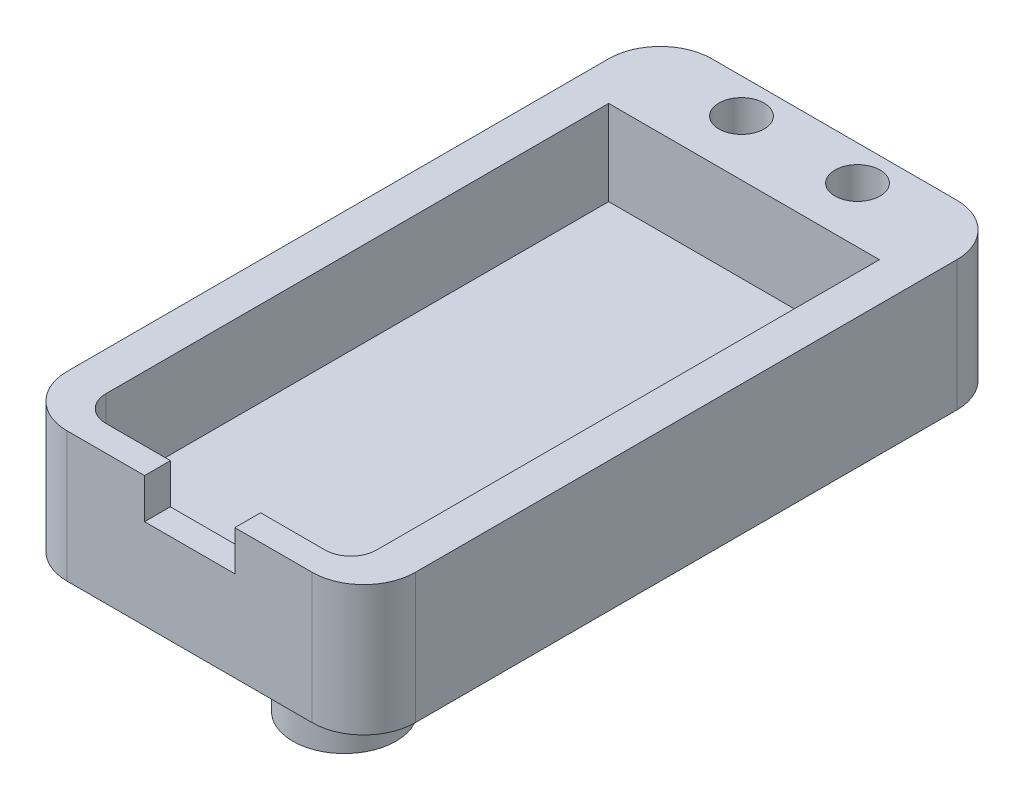
ISO-10303-21;
HEADER;
FILE_DESCRIPTION(('STEP AP214'),'2;1');
FILE_NAME('part.step','',(''),(''),'','','');
FILE_SCHEMA(('AUTOMOTIVE_DESIGN { 1 0 10303 214 1 1 1 1 }'));
ENDSEC;
DATA;
#1=APPLICATION_CONTEXT('core data for automotive mechanical design processes');
#2=APPLICATION_PROTOCOL_DEFINITION('international standard','automotive_design',2000,#1);
#3=PRODUCT_CONTEXT('',#1,'mechanical');
#4=PRODUCT('Part','Part','',(#3));
#5=PRODUCT_RELATED_PRODUCT_CATEGORY('part','',(#4));
#6=PRODUCT_DEFINITION_FORMATION('','',#4);
#7=PRODUCT_DEFINITION_CONTEXT('part definition',#1,'design');
#8=PRODUCT_DEFINITION('design','',#6,#7);
#9=PRODUCT_DEFINITION_SHAPE('','',#8);
#10=(LENGTH_UNIT() NAMED_UNIT(*) SI_UNIT(.MILLI.,.METRE.));
#11=(NAMED_UNIT(*) PLANE_ANGLE_UNIT() SI_UNIT($,.RADIAN.));
#12=(NAMED_UNIT(*) SI_UNIT($,.STERADIAN.) SOLID_ANGLE_UNIT());
#13=UNCERTAINTY_MEASURE_WITH_UNIT(LENGTH_MEASURE(1.E-05),#10,'distance_accuracy_value','');
#14=(GEOMETRIC_REPRESENTATION_CONTEXT(3) GLOBAL_UNCERTAINTY_ASSIGNED_CONTEXT((#13)) GLOBAL_UNIT_ASSIGNED_CONTEXT((#10,
#11,#12)) REPRESENTATION_CONTEXT('',''));
#15=CARTESIAN_POINT('',(0.,0.,0.));
#16=DIRECTION('',(0.,0.,1.));
#17=DIRECTION('',(1.,0.,0.));
#18=AXIS2_PLACEMENT_3D('',#15,#16,#17);
#19=CARTESIAN_POINT('',(0.,3.5,-41.));
#20=DIRECTION('',(1.,0.,0.));
#21=DIRECTION('',(0.,0.,-1.));
#22=AXIS2_PLACEMENT_3D('',#19,#20,#21);
#23=PLANE('',#22);
#24=DIRECTION('',(0.,0.,1.));
#25=VECTOR('',#24,1.);
#26=CARTESIAN_POINT('',(0.,10.1,-48.));
#27=LINE('',#26,#25);
#28=CARTESIAN_POINT('',(0.,10.1,-44.));
#29=VERTEX_POINT('',#28);
#30=CARTESIAN_POINT('',(0.,10.1,-2.00000000000002));
#31=VERTEX_POINT('',#30);
#32=EDGE_CURVE('E339',#29,#31,#27,.T.);
#33=ORIENTED_EDGE('',*,*,#32,.F.);
#34=DIRECTION('',(0.,1.,0.));
#35=VECTOR('',#34,1.);
#36=CARTESIAN_POINT('',(0.,0.,-44.));
#37=LINE('',#36,#35);
#38=CARTESIAN_POINT('',(0.,0.,-44.));
#39=VERTEX_POINT('',#38);
#40=EDGE_CURVE('E253',#29,#39,#37,.F.);
#41=ORIENTED_EDGE('',*,*,#40,.T.);
#42=DIRECTION('',(0.,0.,1.));
#43=VECTOR('',#42,1.);
#44=CARTESIAN_POINT('',(0.,0.,-41.));
#45=LINE('',#44,#43);
#46=CARTESIAN_POINT('',(0.,0.,-2.));
#47=VERTEX_POINT('',#46);
#48=EDGE_CURVE('E219',#39,#47,#45,.T.);
#49=ORIENTED_EDGE('',*,*,#48,.T.);
#50=DIRECTION('',(0.,-1.,0.));
#51=VECTOR('',#50,1.);
#52=CARTESIAN_POINT('',(0.,10.1,-2.));
#53=LINE('',#52,#51);
#54=EDGE_CURVE('E251',#47,#31,#53,.F.);
#55=ORIENTED_EDGE('',*,*,#54,.T.);
#56=EDGE_LOOP('',(#33,#41,#49,#55));
#57=FACE_BOUND('',#56,.T.);
#58=ADVANCED_FACE('F33',(#57),#23,.F.);
#59=CARTESIAN_POINT('',(27.,3.5,-41.));
#60=DIRECTION('',(-1.,0.,0.));
#61=DIRECTION('',(0.,0.,1.));
#62=AXIS2_PLACEMENT_3D('',#59,#60,#61);
#63=PLANE('',#62);
#64=DIRECTION('',(0.,0.,-1.));
#65=VECTOR('',#64,1.);
#66=CARTESIAN_POINT('',(27.,0.,-41.));
#67=LINE('',#66,#65);
#68=CARTESIAN_POINT('',(27.,0.,-2.));
#69=VERTEX_POINT('',#68);
#70=CARTESIAN_POINT('',(27.,0.,-44.));
#71=VERTEX_POINT('',#70);
#72=EDGE_CURVE('E224',#69,#71,#67,.T.);
#73=ORIENTED_EDGE('',*,*,#72,.T.);
#74=DIRECTION('',(0.,-1.,0.));
#75=VECTOR('',#74,1.);
#76=CARTESIAN_POINT('',(27.,10.1,-44.));
#77=LINE('',#76,#75);
#78=CARTESIAN_POINT('',(27.,10.1,-44.));
#79=VERTEX_POINT('',#78);
#80=EDGE_CURVE('E265',#71,#79,#77,.F.);
#81=ORIENTED_EDGE('',*,*,#80,.T.);
#82=DIRECTION('',(0.,0.,-1.));
#83=VECTOR('',#82,1.);
#84=CARTESIAN_POINT('',(27.,10.1,-48.));
#85=LINE('',#84,#83);
#86=CARTESIAN_POINT('',(27.,10.1,-2.00000000000002));
#87=VERTEX_POINT('',#86);
#88=EDGE_CURVE('E170',#87,#79,#85,.T.);
#89=ORIENTED_EDGE('',*,*,#88,.F.);
#90=DIRECTION('',(0.,1.,0.));
#91=VECTOR('',#90,1.);
#92=CARTESIAN_POINT('',(27.,0.,-2.));
#93=LINE('',#92,#91);
#94=EDGE_CURVE('E263',#87,#69,#93,.F.);
#95=ORIENTED_EDGE('',*,*,#94,.T.);
#96=EDGE_LOOP('',(#73,#81,#89,#95));
#97=FACE_BOUND('',#96,.T.);
#98=ADVANCED_FACE('F365',(#97),#63,.F.);
#99=CARTESIAN_POINT('',(3.,11.,0.));
#100=DIRECTION('',(-1.,0.,0.));
#101=DIRECTION('',(0.,0.,1.));
#102=AXIS2_PLACEMENT_3D('',#99,#100,#101);
#103=PLANE('',#102);
#104=DIRECTION('',(0.,0.,-1.));
#105=VECTOR('',#104,1.);
#106=CARTESIAN_POINT('',(3.,10.1,0.));
#107=LINE('',#106,#105);
#108=CARTESIAN_POINT('',(3.,10.1,-2.));
#109=VERTEX_POINT('',#108);
#110=CARTESIAN_POINT('',(3.,10.1,-41.));
#111=VERTEX_POINT('',#110);
#112=EDGE_CURVE('E313',#109,#111,#107,.T.);
#113=ORIENTED_EDGE('',*,*,#112,.F.);
#114=DIRECTION('',(0.,-1.,0.));
#115=VECTOR('',#114,1.);
#116=CARTESIAN_POINT('',(3.,3.5,-2.));
#117=LINE('',#116,#115);
#118=CARTESIAN_POINT('',(3.,3.5,-2.));
#119=VERTEX_POINT('',#118);
#120=EDGE_CURVE('E282',#109,#119,#117,.T.);
#121=ORIENTED_EDGE('',*,*,#120,.T.);
#122=DIRECTION('',(0.,0.,-1.));
#123=VECTOR('',#122,1.);
#124=CARTESIAN_POINT('',(3.,3.5,0.));
#125=LINE('',#124,#123);
#126=CARTESIAN_POINT('',(3.,3.5,-41.));
#127=VERTEX_POINT('',#126);
#128=EDGE_CURVE('E214',#119,#127,#125,.T.);
#129=ORIENTED_EDGE('',*,*,#128,.T.);
#130=DIRECTION('',(0.,-1.,0.));
#131=VECTOR('',#130,1.);
#132=CARTESIAN_POINT('',(3.,11.,-41.));
#133=LINE('',#132,#131);
#134=EDGE_CURVE('E216',#111,#127,#133,.T.);
#135=ORIENTED_EDGE('',*,*,#134,.F.);
#136=EDGE_LOOP('',(#113,#121,#129,#135));
#137=FACE_BOUND('',#136,.T.);
#138=ADVANCED_FACE('F311',(#137),#103,.F.);
#139=CARTESIAN_POINT('',(24.,11.,-41.));
#140=DIRECTION('',(1.,0.,0.));
#141=DIRECTION('',(0.,0.,-1.));
#142=AXIS2_PLACEMENT_3D('',#139,#140,#141);
#143=PLANE('',#142);
#144=DIRECTION('',(0.,0.,1.));
#145=VECTOR('',#144,1.);
#146=CARTESIAN_POINT('',(24.,3.5,-41.));
#147=LINE('',#146,#145);
#148=CARTESIAN_POINT('',(24.,3.5,-41.));
#149=VERTEX_POINT('',#148);
#150=CARTESIAN_POINT('',(24.,3.5,-2.));
#151=VERTEX_POINT('',#150);
#152=EDGE_CURVE('E210',#149,#151,#147,.T.);
#153=ORIENTED_EDGE('',*,*,#152,.T.);
#154=DIRECTION('',(0.,-1.,0.));
#155=VECTOR('',#154,1.);
#156=CARTESIAN_POINT('',(24.,10.1,-2.));
#157=LINE('',#156,#155);
#158=CARTESIAN_POINT('',(24.,10.1,-2.));
#159=VERTEX_POINT('',#158);
#160=EDGE_CURVE('E54',#151,#159,#157,.F.);
#161=ORIENTED_EDGE('',*,*,#160,.T.);
#162=DIRECTION('',(0.,0.,1.));
#163=VECTOR('',#162,1.);
#164=CARTESIAN_POINT('',(24.,10.1,-41.));
#165=LINE('',#164,#163);
#166=CARTESIAN_POINT('',(24.,10.1,-41.));
#167=VERTEX_POINT('',#166);
#168=EDGE_CURVE('E288',#167,#159,#165,.T.);
#169=ORIENTED_EDGE('',*,*,#168,.F.);
#170=DIRECTION('',(0.,-1.,0.));
#171=VECTOR('',#170,1.);
#172=CARTESIAN_POINT('',(24.,11.,-41.));
#173=LINE('',#172,#171);
#174=EDGE_CURVE('E212',#167,#149,#173,.T.);
#175=ORIENTED_EDGE('',*,*,#174,.T.);
#176=EDGE_LOOP('',(#153,#161,#169,#175));
#177=FACE_BOUND('',#176,.T.);
#178=ADVANCED_FACE('F302',(#177),#143,.F.);
#179=CARTESIAN_POINT('',(0.,0.,-41.));
#180=DIRECTION('',(0.,0.,-1.));
#181=DIRECTION('',(-1.,0.,0.));
#182=AXIS2_PLACEMENT_3D('',#179,#180,#181);
#183=PLANE('',#182);
#184=DIRECTION('',(1.,0.,0.));
#185=VECTOR('',#184,1.);
#186=CARTESIAN_POINT('',(0.,10.1,-41.));
#187=LINE('',#186,#185);
#188=EDGE_CURVE('E316',#111,#167,#187,.T.);
#189=ORIENTED_EDGE('',*,*,#188,.F.);
#190=ORIENTED_EDGE('',*,*,#134,.T.);
#191=DIRECTION('',(-1.,0.,0.));
#192=VECTOR('',#191,1.);
#193=CARTESIAN_POINT('',(0.,3.5,-41.));
#194=LINE('',#193,#192);
#195=EDGE_CURVE('E223',#149,#127,#194,.T.);
#196=ORIENTED_EDGE('',*,*,#195,.F.);
#197=ORIENTED_EDGE('',*,*,#174,.F.);
#198=EDGE_LOOP('',(#189,#190,#196,#197));
#199=FACE_BOUND('',#198,.T.);
#200=ADVANCED_FACE('F307',(#199),#183,.F.);
#201=CARTESIAN_POINT('',(0.,0.,0.));
#202=DIRECTION('',(0.,0.,1.));
#203=DIRECTION('',(1.,0.,0.));
#204=AXIS2_PLACEMENT_3D('',#201,#202,#203);
#205=PLANE('',#204);
#206=DIRECTION('',(-1.,0.,0.));
#207=VECTOR('',#206,1.);
#208=CARTESIAN_POINT('',(0.,10.1,0.));
#209=LINE('',#208,#207);
#210=CARTESIAN_POINT('',(22.,10.1,0.));
#211=VERTEX_POINT('',#210);
#212=CARTESIAN_POINT('',(17.,10.1,0.));
#213=VERTEX_POINT('',#212);
#214=EDGE_CURVE('E286',#211,#213,#209,.T.);
#215=ORIENTED_EDGE('',*,*,#214,.F.);
#216=DIRECTION('',(0.,-1.,0.));
#217=VECTOR('',#216,1.);
#218=CARTESIAN_POINT('',(22.,3.5,0.));
#219=LINE('',#218,#217);
#220=CARTESIAN_POINT('',(22.,3.5,0.));
#221=VERTEX_POINT('',#220);
#222=EDGE_CURVE('E274',#211,#221,#219,.T.);
#223=ORIENTED_EDGE('',*,*,#222,.T.);
#224=DIRECTION('',(1.,0.,0.));
#225=VECTOR('',#224,1.);
#226=CARTESIAN_POINT('',(0.,3.5,0.));
#227=LINE('',#226,#225);
#228=CARTESIAN_POINT('',(5.,3.5,0.));
#229=VERTEX_POINT('',#228);
#230=EDGE_CURVE('E220',#229,#221,#227,.T.);
#231=ORIENTED_EDGE('',*,*,#230,.F.);
#232=DIRECTION('',(0.,-1.,0.));
#233=VECTOR('',#232,1.);
#234=CARTESIAN_POINT('',(5.,10.1,0.));
#235=LINE('',#234,#233);
#236=CARTESIAN_POINT('',(5.,10.1,0.));
#237=VERTEX_POINT('',#236);
#238=EDGE_CURVE('E272',#229,#237,#235,.F.);
#239=ORIENTED_EDGE('',*,*,#238,.T.);
#240=CARTESIAN_POINT('',(10.,10.1,0.));
#241=VERTEX_POINT('',#240);
#242=EDGE_CURVE('E180',#241,#237,#209,.T.);
#243=ORIENTED_EDGE('',*,*,#242,.F.);
#244=DIRECTION('',(0.,1.,0.));
#245=VECTOR('',#244,1.);
#246=CARTESIAN_POINT('',(10.,11.,0.));
#247=LINE('',#246,#245);
#248=CARTESIAN_POINT('',(10.,7.,0.));
#249=VERTEX_POINT('',#248);
#250=EDGE_CURVE('E179',#249,#241,#247,.T.);
#251=ORIENTED_EDGE('',*,*,#250,.F.);
#252=DIRECTION('',(-1.,0.,0.));
#253=VECTOR('',#252,1.);
#254=CARTESIAN_POINT('',(10.,7.,0.));
#255=LINE('',#254,#253);
#256=CARTESIAN_POINT('',(17.,7.,0.));
#257=VERTEX_POINT('',#256);
#258=EDGE_CURVE('E201',#257,#249,#255,.T.);
#259=ORIENTED_EDGE('',*,*,#258,.F.);
#260=DIRECTION('',(0.,-1.,0.));
#261=VECTOR('',#260,1.);
#262=CARTESIAN_POINT('',(17.,11.,0.));
#263=LINE('',#262,#261);
#264=EDGE_CURVE('E192',#213,#257,#263,.T.);
#265=ORIENTED_EDGE('',*,*,#264,.F.);
#266=EDGE_LOOP('',(#215,#223,#231,#239,#243,#251,#259,#265));
#267=FACE_BOUND('',#266,.T.);
#268=ADVANCED_FACE('F293',(#267),#205,.F.);
#269=CARTESIAN_POINT('',(0.,0.,2.));
#270=DIRECTION('',(0.,0.,1.));
#271=DIRECTION('',(1.,0.,0.));
#272=AXIS2_PLACEMENT_3D('',#269,#270,#271);
#273=PLANE('',#272);
#274=DIRECTION('',(1.,0.,0.));
#275=VECTOR('',#274,1.);
#276=CARTESIAN_POINT('',(0.,0.,2.));
#277=LINE('',#276,#275);
#278=CARTESIAN_POINT('',(4.,0.,2.));
#279=VERTEX_POINT('',#278);
#280=CARTESIAN_POINT('',(23.,0.,2.));
#281=VERTEX_POINT('',#280);
#282=EDGE_CURVE('E205',#279,#281,#277,.T.);
#283=ORIENTED_EDGE('',*,*,#282,.T.);
#284=DIRECTION('',(0.,1.,0.));
#285=VECTOR('',#284,1.);
#286=CARTESIAN_POINT('',(23.,10.1,2.));
#287=LINE('',#286,#285);
#288=CARTESIAN_POINT('',(23.,10.1,2.));
#289=VERTEX_POINT('',#288);
#290=EDGE_CURVE('E269',#281,#289,#287,.T.);
#291=ORIENTED_EDGE('',*,*,#290,.T.);
#292=DIRECTION('',(1.,0.,0.));
#293=VECTOR('',#292,1.);
#294=CARTESIAN_POINT('',(0.,10.1,2.));
#295=LINE('',#294,#293);
#296=CARTESIAN_POINT('',(17.,10.1,2.));
#297=VERTEX_POINT('',#296);
#298=EDGE_CURVE('E171',#297,#289,#295,.T.);
#299=ORIENTED_EDGE('',*,*,#298,.F.);
#300=DIRECTION('',(0.,1.,0.));
#301=VECTOR('',#300,1.);
#302=CARTESIAN_POINT('',(17.,11.,2.));
#303=LINE('',#302,#301);
#304=CARTESIAN_POINT('',(17.,7.,2.));
#305=VERTEX_POINT('',#304);
#306=EDGE_CURVE('E190',#305,#297,#303,.T.);
#307=ORIENTED_EDGE('',*,*,#306,.F.);
#308=DIRECTION('',(1.,0.,0.));
#309=VECTOR('',#308,1.);
#310=CARTESIAN_POINT('',(10.,7.,2.));
#311=LINE('',#310,#309);
#312=CARTESIAN_POINT('',(10.,7.,2.));
#313=VERTEX_POINT('',#312);
#314=EDGE_CURVE('E188',#313,#305,#311,.T.);
#315=ORIENTED_EDGE('',*,*,#314,.F.);
#316=DIRECTION('',(0.,-1.,0.));
#317=VECTOR('',#316,1.);
#318=CARTESIAN_POINT('',(10.,11.,2.));
#319=LINE('',#318,#317);
#320=CARTESIAN_POINT('',(10.,10.1,2.));
#321=VERTEX_POINT('',#320);
#322=EDGE_CURVE('E176',#321,#313,#319,.T.);
#323=ORIENTED_EDGE('',*,*,#322,.F.);
#324=CARTESIAN_POINT('',(4.,10.1,2.));
#325=VERTEX_POINT('',#324);
#326=EDGE_CURVE('E157',#325,#321,#295,.T.);
#327=ORIENTED_EDGE('',*,*,#326,.F.);
#328=DIRECTION('',(0.,-1.,0.));
#329=VECTOR('',#328,1.);
#330=CARTESIAN_POINT('',(4.,0.,2.));
#331=LINE('',#330,#329);
#332=EDGE_CURVE('E267',#325,#279,#331,.T.);
#333=ORIENTED_EDGE('',*,*,#332,.T.);
#334=EDGE_LOOP('',(#283,#291,#299,#307,#315,#323,#327,#333));
#335=FACE_BOUND('',#334,.T.);
#336=ADVANCED_FACE('F185',(#335),#273,.T.);
#337=CARTESIAN_POINT('',(17.,11.,-43.001));
#338=DIRECTION('',(1.,0.,0.));
#339=DIRECTION('',(0.,0.,-1.));
#340=AXIS2_PLACEMENT_3D('',#337,#338,#339);
#341=PLANE('',#340);
#342=DIRECTION('',(0.,0.,1.));
#343=VECTOR('',#342,1.);
#344=CARTESIAN_POINT('',(17.,10.1,-43.001));
#345=LINE('',#344,#343);
#346=EDGE_CURVE('E296',#213,#297,#345,.T.);
#347=ORIENTED_EDGE('',*,*,#346,.F.);
#348=ORIENTED_EDGE('',*,*,#264,.T.);
#349=DIRECTION('',(0.,0.,1.));
#350=VECTOR('',#349,1.);
#351=CARTESIAN_POINT('',(17.,7.,-43.001));
#352=LINE('',#351,#350);
#353=EDGE_CURVE('E199',#257,#305,#352,.T.);
#354=ORIENTED_EDGE('',*,*,#353,.T.);
#355=ORIENTED_EDGE('',*,*,#306,.T.);
#356=EDGE_LOOP('',(#347,#348,#354,#355));
#357=FACE_BOUND('',#356,.T.);
#358=ADVANCED_FACE('F333',(#357),#341,.F.);
#359=CARTESIAN_POINT('',(10.,11.,-43.001));
#360=DIRECTION('',(-1.,0.,0.));
#361=DIRECTION('',(0.,0.,1.));
#362=AXIS2_PLACEMENT_3D('',#359,#360,#361);
#363=PLANE('',#362);
#364=DIRECTION('',(0.,0.,-1.));
#365=VECTOR('',#364,1.);
#366=CARTESIAN_POINT('',(10.,10.1,-43.001));
#367=LINE('',#366,#365);
#368=EDGE_CURVE('E161',#321,#241,#367,.T.);
#369=ORIENTED_EDGE('',*,*,#368,.F.);
#370=ORIENTED_EDGE('',*,*,#322,.T.);
#371=DIRECTION('',(0.,0.,1.));
#372=VECTOR('',#371,1.);
#373=CARTESIAN_POINT('',(10.,7.,-43.001));
#374=LINE('',#373,#372);
#375=EDGE_CURVE('E198',#249,#313,#374,.T.);
#376=ORIENTED_EDGE('',*,*,#375,.F.);
#377=ORIENTED_EDGE('',*,*,#250,.T.);
#378=EDGE_LOOP('',(#369,#370,#376,#377));
#379=FACE_BOUND('',#378,.T.);
#380=ADVANCED_FACE('F175',(#379),#363,.F.);
#381=CARTESIAN_POINT('',(0.,0.,-48.));
#382=DIRECTION('',(0.,0.,-1.));
#383=DIRECTION('',(-1.,0.,0.));
#384=AXIS2_PLACEMENT_3D('',#381,#382,#383);
#385=PLANE('',#384);
#386=DIRECTION('',(-1.,0.,0.));
#387=VECTOR('',#386,1.);
#388=CARTESIAN_POINT('',(27.,0.,-48.));
#389=LINE('',#388,#387);
#390=CARTESIAN_POINT('',(23.,0.,-48.));
#391=VERTEX_POINT('',#390);
#392=CARTESIAN_POINT('',(3.99999999999998,0.,-48.));
#393=VERTEX_POINT('',#392);
#394=EDGE_CURVE('E329',#391,#393,#389,.T.);
#395=ORIENTED_EDGE('',*,*,#394,.T.);
#396=DIRECTION('',(0.,1.,0.));
#397=VECTOR('',#396,1.);
#398=CARTESIAN_POINT('',(3.99999999999998,10.1,-48.));
#399=LINE('',#398,#397);
#400=CARTESIAN_POINT('',(3.99999999999998,10.1,-48.));
#401=VERTEX_POINT('',#400);
#402=EDGE_CURVE('E241',#393,#401,#399,.T.);
#403=ORIENTED_EDGE('',*,*,#402,.T.);
#404=DIRECTION('',(-1.,0.,0.));
#405=VECTOR('',#404,1.);
#406=CARTESIAN_POINT('',(0.,10.1,-48.));
#407=LINE('',#406,#405);
#408=CARTESIAN_POINT('',(23.,10.1,-48.));
#409=VERTEX_POINT('',#408);
#410=EDGE_CURVE('E238',#409,#401,#407,.T.);
#411=ORIENTED_EDGE('',*,*,#410,.F.);
#412=DIRECTION('',(0.,-1.,0.));
#413=VECTOR('',#412,1.);
#414=CARTESIAN_POINT('',(23.,0.,-48.));
#415=LINE('',#414,#413);
#416=EDGE_CURVE('E234',#409,#391,#415,.T.);
#417=ORIENTED_EDGE('',*,*,#416,.T.);
#418=EDGE_LOOP('',(#395,#403,#411,#417));
#419=FACE_BOUND('',#418,.T.);
#420=ADVANCED_FACE('F352',(#419),#385,.T.);
#421=CARTESIAN_POINT('',(8.99999999999999,-10.,-45.3));
#422=DIRECTION('',(0.,1.,0.));
#423=DIRECTION('',(0.,0.,1.));
#424=AXIS2_PLACEMENT_3D('',#421,#422,#423);
#425=CYLINDRICAL_SURFACE('',#424,1.75);
#426=CARTESIAN_POINT('',(8.99999999999999,0.,-45.3));
#427=DIRECTION('',(0.,1.,0.));
#428=DIRECTION('',(0.,0.,1.));
#429=AXIS2_PLACEMENT_3D('',#426,#427,#428);
#430=CIRCLE('',#429,1.75);
#431=CARTESIAN_POINT('',(8.99999999999999,0.,-43.55));
#432=VERTEX_POINT('',#431);
#433=EDGE_CURVE('E323',#432,#432,#430,.T.);
#434=ORIENTED_EDGE('',*,*,#433,.F.);
#435=EDGE_LOOP('',(#434));
#436=FACE_BOUND('',#435,.T.);
#437=CARTESIAN_POINT('',(8.99999999999999,10.1,-45.3));
#438=DIRECTION('',(0.,1.,0.));
#439=DIRECTION('',(0.,0.,1.));
#440=AXIS2_PLACEMENT_3D('',#437,#438,#439);
#441=CIRCLE('',#440,1.75);
#442=CARTESIAN_POINT('',(8.99999999999999,10.1,-43.55));
#443=VERTEX_POINT('',#442);
#444=EDGE_CURVE('E181',#443,#443,#441,.F.);
#445=ORIENTED_EDGE('',*,*,#444,.F.);
#446=EDGE_LOOP('',(#445));
#447=FACE_BOUND('',#446,.T.);
#448=ADVANCED_FACE('F349',(#436,#447),#425,.F.);
#449=CARTESIAN_POINT('',(18.,-10.,-45.3));
#450=DIRECTION('',(0.,1.,0.));
#451=DIRECTION('',(0.,0.,1.));
#452=AXIS2_PLACEMENT_3D('',#449,#450,#451);
#453=CYLINDRICAL_SURFACE('',#452,1.75);
#454=CARTESIAN_POINT('',(18.,0.,-45.3));
#455=DIRECTION('',(0.,1.,0.));
#456=DIRECTION('',(0.,0.,1.));
#457=AXIS2_PLACEMENT_3D('',#454,#455,#456);
#458=CIRCLE('',#457,1.75);
#459=CARTESIAN_POINT('',(18.,0.,-43.55));
#460=VERTEX_POINT('',#459);
#461=EDGE_CURVE('E326',#460,#460,#458,.T.);
#462=ORIENTED_EDGE('',*,*,#461,.F.);
#463=EDGE_LOOP('',(#462));
#464=FACE_BOUND('',#463,.T.);
#465=CARTESIAN_POINT('',(18.,10.1,-45.3));
#466=DIRECTION('',(0.,1.,0.));
#467=DIRECTION('',(0.,0.,1.));
#468=AXIS2_PLACEMENT_3D('',#465,#466,#467);
#469=CIRCLE('',#468,1.75);
#470=CARTESIAN_POINT('',(18.,10.1,-43.55));
#471=VERTEX_POINT('',#470);
#472=EDGE_CURVE('E235',#471,#471,#469,.F.);
#473=ORIENTED_EDGE('',*,*,#472,.F.);
#474=EDGE_LOOP('',(#473));
#475=FACE_BOUND('',#474,.T.);
#476=ADVANCED_FACE('F351',(#464,#475),#453,.F.);
#477=CARTESIAN_POINT('',(0.,3.5,0.));
#478=DIRECTION('',(0.,1.,0.));
#479=DIRECTION('',(0.,0.,1.));
#480=AXIS2_PLACEMENT_3D('',#477,#478,#479);
#481=PLANE('',#480);
#482=ORIENTED_EDGE('',*,*,#230,.T.);
#483=CARTESIAN_POINT('',(22.,3.5,-2.));
#484=DIRECTION('',(0.,1.,0.));
#485=DIRECTION('',(0.,0.,1.));
#486=AXIS2_PLACEMENT_3D('',#483,#484,#485);
#487=CIRCLE('',#486,2.);
#488=EDGE_CURVE('E279',#221,#151,#487,.T.);
#489=ORIENTED_EDGE('',*,*,#488,.T.);
#490=ORIENTED_EDGE('',*,*,#152,.F.);
#491=ORIENTED_EDGE('',*,*,#195,.T.);
#492=ORIENTED_EDGE('',*,*,#128,.F.);
#493=CARTESIAN_POINT('',(5.,3.5,-2.));
#494=DIRECTION('',(0.,1.,0.));
#495=DIRECTION('',(0.,0.,1.));
#496=AXIS2_PLACEMENT_3D('',#493,#494,#495);
#497=CIRCLE('',#496,2.);
#498=EDGE_CURVE('E277',#119,#229,#497,.T.);
#499=ORIENTED_EDGE('',*,*,#498,.T.);
#500=EDGE_LOOP('',(#482,#489,#490,#491,#492,#499));
#501=FACE_BOUND('',#500,.T.);
#502=ADVANCED_FACE('F301',(#501),#481,.T.);
#503=CARTESIAN_POINT('',(0.,0.,0.));
#504=DIRECTION('',(0.,1.,0.));
#505=DIRECTION('',(0.,0.,1.));
#506=AXIS2_PLACEMENT_3D('',#503,#504,#505);
#507=PLANE('',#506);
#508=ORIENTED_EDGE('',*,*,#461,.T.);
#509=EDGE_LOOP('',(#508));
#510=FACE_BOUND('',#509,.T.);
#511=ORIENTED_EDGE('',*,*,#433,.T.);
#512=EDGE_LOOP('',(#511));
#513=FACE_BOUND('',#512,.T.);
#514=CARTESIAN_POINT('',(13.5,0.,-10.));
#515=DIRECTION('',(0.,1.,0.));
#516=DIRECTION('',(0.,0.,1.));
#517=AXIS2_PLACEMENT_3D('',#514,#515,#516);
#518=CIRCLE('',#517,4.);
#519=CARTESIAN_POINT('',(13.5,0.,-6.));
#520=VERTEX_POINT('',#519);
#521=EDGE_CURVE('E227',#520,#520,#518,.F.);
#522=ORIENTED_EDGE('',*,*,#521,.F.);
#523=EDGE_LOOP('',(#522));
#524=FACE_BOUND('',#523,.T.);
#525=ORIENTED_EDGE('',*,*,#48,.F.);
#526=CARTESIAN_POINT('',(3.99999999999998,0.,-44.));
#527=DIRECTION('',(0.,1.,0.));
#528=DIRECTION('',(0.,0.,1.));
#529=AXIS2_PLACEMENT_3D('',#526,#527,#528);
#530=CIRCLE('',#529,4.);
#531=EDGE_CURVE('E261',#39,#393,#530,.F.);
#532=ORIENTED_EDGE('',*,*,#531,.T.);
#533=ORIENTED_EDGE('',*,*,#394,.F.);
#534=CARTESIAN_POINT('',(23.,0.,-44.));
#535=DIRECTION('',(0.,1.,0.));
#536=DIRECTION('',(0.,0.,1.));
#537=AXIS2_PLACEMENT_3D('',#534,#535,#536);
#538=CIRCLE('',#537,4.);
#539=EDGE_CURVE('E259',#391,#71,#538,.F.);
#540=ORIENTED_EDGE('',*,*,#539,.T.);
#541=ORIENTED_EDGE('',*,*,#72,.F.);
#542=CARTESIAN_POINT('',(23.,0.,-2.));
#543=DIRECTION('',(0.,1.,0.));
#544=DIRECTION('',(0.,0.,1.));
#545=AXIS2_PLACEMENT_3D('',#542,#543,#544);
#546=CIRCLE('',#545,4.);
#547=EDGE_CURVE('E257',#69,#281,#546,.F.);
#548=ORIENTED_EDGE('',*,*,#547,.T.);
#549=ORIENTED_EDGE('',*,*,#282,.F.);
#550=CARTESIAN_POINT('',(4.,0.,-2.));
#551=DIRECTION('',(0.,1.,0.));
#552=DIRECTION('',(0.,0.,1.));
#553=AXIS2_PLACEMENT_3D('',#550,#551,#552);
#554=CIRCLE('',#553,4.);
#555=EDGE_CURVE('E255',#279,#47,#554,.F.);
#556=ORIENTED_EDGE('',*,*,#555,.T.);
#557=EDGE_LOOP('',(#525,#532,#533,#540,#541,#548,#549,#556));
#558=FACE_BOUND('',#557,.T.);
#559=ADVANCED_FACE('F422',(#510,#513,#524,#558),#507,.F.);
#560=CARTESIAN_POINT('',(13.5,-10.,-10.));
#561=DIRECTION('',(0.,1.,0.));
#562=DIRECTION('',(0.,0.,1.));
#563=AXIS2_PLACEMENT_3D('',#560,#561,#562);
#564=CYLINDRICAL_SURFACE('',#563,4.);
#565=CARTESIAN_POINT('',(13.5,-10.,-10.));
#566=DIRECTION('',(0.,-1.,0.));
#567=DIRECTION('',(0.,0.,-1.));
#568=AXIS2_PLACEMENT_3D('',#565,#566,#567);
#569=CIRCLE('',#568,4.);
#570=CARTESIAN_POINT('',(13.5,-10.,-14.));
#571=VERTEX_POINT('',#570);
#572=EDGE_CURVE('E207',#571,#571,#569,.T.);
#573=ORIENTED_EDGE('',*,*,#572,.F.);
#574=EDGE_LOOP('',(#573));
#575=FACE_BOUND('',#574,.T.);
#576=ORIENTED_EDGE('',*,*,#521,.T.);
#577=EDGE_LOOP('',(#576));
#578=FACE_BOUND('',#577,.T.);
#579=ADVANCED_FACE('F484',(#575,#578),#564,.T.);
#580=CARTESIAN_POINT('',(13.5,-10.,-10.));
#581=DIRECTION('',(0.,-1.,0.));
#582=DIRECTION('',(0.,0.,-1.));
#583=AXIS2_PLACEMENT_3D('',#580,#581,#582);
#584=PLANE('',#583);
#585=ORIENTED_EDGE('',*,*,#572,.T.);
#586=EDGE_LOOP('',(#585));
#587=FACE_BOUND('',#586,.T.);
#588=ADVANCED_FACE('F550',(#587),#584,.T.);
#589=CARTESIAN_POINT('',(10.,7.,-43.001));
#590=DIRECTION('',(0.,-1.,0.));
#591=DIRECTION('',(0.,0.,-1.));
#592=AXIS2_PLACEMENT_3D('',#589,#590,#591);
#593=PLANE('',#592);
#594=ORIENTED_EDGE('',*,*,#258,.T.);
#595=ORIENTED_EDGE('',*,*,#375,.T.);
#596=ORIENTED_EDGE('',*,*,#314,.T.);
#597=ORIENTED_EDGE('',*,*,#353,.F.);
#598=EDGE_LOOP('',(#594,#595,#596,#597));
#599=FACE_BOUND('',#598,.T.);
#600=ADVANCED_FACE('F335',(#599),#593,.F.);
#601=CARTESIAN_POINT('',(0.,10.1,0.));
#602=DIRECTION('',(0.,1.,0.));
#603=DIRECTION('',(0.,0.,1.));
#604=AXIS2_PLACEMENT_3D('',#601,#602,#603);
#605=PLANE('',#604);
#606=ORIENTED_EDGE('',*,*,#444,.T.);
#607=EDGE_LOOP('',(#606));
#608=FACE_BOUND('',#607,.T.);
#609=ORIENTED_EDGE('',*,*,#472,.T.);
#610=EDGE_LOOP('',(#609));
#611=FACE_BOUND('',#610,.T.);
#612=ORIENTED_EDGE('',*,*,#410,.T.);
#613=CARTESIAN_POINT('',(3.99999999999998,10.1,-44.));
#614=DIRECTION('',(0.,1.,0.));
#615=DIRECTION('',(0.,0.,1.));
#616=AXIS2_PLACEMENT_3D('',#613,#614,#615);
#617=CIRCLE('',#616,4.);
#618=EDGE_CURVE('E249',#401,#29,#617,.T.);
#619=ORIENTED_EDGE('',*,*,#618,.T.);
#620=ORIENTED_EDGE('',*,*,#32,.T.);
#621=CARTESIAN_POINT('',(4.,10.1,-2.));
#622=DIRECTION('',(0.,1.,0.));
#623=DIRECTION('',(0.,0.,1.));
#624=AXIS2_PLACEMENT_3D('',#621,#622,#623);
#625=CIRCLE('',#624,4.);
#626=EDGE_CURVE('E165',#31,#325,#625,.T.);
#627=ORIENTED_EDGE('',*,*,#626,.T.);
#628=ORIENTED_EDGE('',*,*,#326,.T.);
#629=ORIENTED_EDGE('',*,*,#368,.T.);
#630=ORIENTED_EDGE('',*,*,#242,.T.);
#631=CARTESIAN_POINT('',(5.,10.1,-2.));
#632=DIRECTION('',(0.,1.,0.));
#633=DIRECTION('',(0.,0.,1.));
#634=AXIS2_PLACEMENT_3D('',#631,#632,#633);
#635=CIRCLE('',#634,2.);
#636=EDGE_CURVE('E11',#237,#109,#635,.F.);
#637=ORIENTED_EDGE('',*,*,#636,.T.);
#638=ORIENTED_EDGE('',*,*,#112,.T.);
#639=ORIENTED_EDGE('',*,*,#188,.T.);
#640=ORIENTED_EDGE('',*,*,#168,.T.);
#641=CARTESIAN_POINT('',(22.,10.1,-2.));
#642=DIRECTION('',(0.,1.,0.));
#643=DIRECTION('',(0.,0.,1.));
#644=AXIS2_PLACEMENT_3D('',#641,#642,#643);
#645=CIRCLE('',#644,2.);
#646=EDGE_CURVE('E41',#159,#211,#645,.F.);
#647=ORIENTED_EDGE('',*,*,#646,.T.);
#648=ORIENTED_EDGE('',*,*,#214,.T.);
#649=ORIENTED_EDGE('',*,*,#346,.T.);
#650=ORIENTED_EDGE('',*,*,#298,.T.);
#651=CARTESIAN_POINT('',(23.,10.1,-2.));
#652=DIRECTION('',(0.,1.,0.));
#653=DIRECTION('',(0.,0.,1.));
#654=AXIS2_PLACEMENT_3D('',#651,#652,#653);
#655=CIRCLE('',#654,4.);
#656=EDGE_CURVE('E245',#289,#87,#655,.T.);
#657=ORIENTED_EDGE('',*,*,#656,.T.);
#658=ORIENTED_EDGE('',*,*,#88,.T.);
#659=CARTESIAN_POINT('',(23.,10.1,-44.));
#660=DIRECTION('',(0.,1.,0.));
#661=DIRECTION('',(0.,0.,1.));
#662=AXIS2_PLACEMENT_3D('',#659,#660,#661);
#663=CIRCLE('',#662,4.);
#664=EDGE_CURVE('E247',#79,#409,#663,.T.);
#665=ORIENTED_EDGE('',*,*,#664,.T.);
#666=EDGE_LOOP('',(#612,#619,#620,#627,#628,#629,#630,#637,#638,#639,#640,#647,#648,#649,#650,
#657,#658,#665));
#667=FACE_BOUND('',#666,.T.);
#668=ADVANCED_FACE('F160',(#608,#611,#667),#605,.T.);
#669=CARTESIAN_POINT('',(3.99999999999998,0.,-44.));
#670=DIRECTION('',(0.,-1.,0.));
#671=DIRECTION('',(0.,0.,-1.));
#672=AXIS2_PLACEMENT_3D('',#669,#670,#671);
#673=CYLINDRICAL_SURFACE('',#672,4.);
#674=ORIENTED_EDGE('',*,*,#531,.F.);
#675=ORIENTED_EDGE('',*,*,#40,.F.);
#676=ORIENTED_EDGE('',*,*,#618,.F.);
#677=ORIENTED_EDGE('',*,*,#402,.F.);
#678=EDGE_LOOP('',(#674,#675,#676,#677));
#679=FACE_BOUND('',#678,.T.);
#680=ADVANCED_FACE('F376',(#679),#673,.T.);
#681=CARTESIAN_POINT('',(23.,0.,-44.));
#682=DIRECTION('',(0.,1.,0.));
#683=DIRECTION('',(0.,0.,1.));
#684=AXIS2_PLACEMENT_3D('',#681,#682,#683);
#685=CYLINDRICAL_SURFACE('',#684,4.);
#686=ORIENTED_EDGE('',*,*,#664,.F.);
#687=ORIENTED_EDGE('',*,*,#80,.F.);
#688=ORIENTED_EDGE('',*,*,#539,.F.);
#689=ORIENTED_EDGE('',*,*,#416,.F.);
#690=EDGE_LOOP('',(#686,#687,#688,#689));
#691=FACE_BOUND('',#690,.T.);
#692=ADVANCED_FACE('F379',(#691),#685,.T.);
#693=CARTESIAN_POINT('',(23.,0.,-2.));
#694=DIRECTION('',(0.,-1.,0.));
#695=DIRECTION('',(0.,0.,-1.));
#696=AXIS2_PLACEMENT_3D('',#693,#694,#695);
#697=CYLINDRICAL_SURFACE('',#696,4.);
#698=ORIENTED_EDGE('',*,*,#547,.F.);
#699=ORIENTED_EDGE('',*,*,#94,.F.);
#700=ORIENTED_EDGE('',*,*,#656,.F.);
#701=ORIENTED_EDGE('',*,*,#290,.F.);
#702=EDGE_LOOP('',(#698,#699,#700,#701));
#703=FACE_BOUND('',#702,.T.);
#704=ADVANCED_FACE('F383',(#703),#697,.T.);
#705=CARTESIAN_POINT('',(4.,0.,-2.));
#706=DIRECTION('',(0.,1.,0.));
#707=DIRECTION('',(0.,0.,1.));
#708=AXIS2_PLACEMENT_3D('',#705,#706,#707);
#709=CYLINDRICAL_SURFACE('',#708,4.);
#710=ORIENTED_EDGE('',*,*,#626,.F.);
#711=ORIENTED_EDGE('',*,*,#54,.F.);
#712=ORIENTED_EDGE('',*,*,#555,.F.);
#713=ORIENTED_EDGE('',*,*,#332,.F.);
#714=EDGE_LOOP('',(#710,#711,#712,#713));
#715=FACE_BOUND('',#714,.T.);
#716=ADVANCED_FACE('F387',(#715),#709,.T.);
#717=CARTESIAN_POINT('',(22.,0.,-2.));
#718=DIRECTION('',(0.,1.,0.));
#719=DIRECTION('',(0.,0.,1.));
#720=AXIS2_PLACEMENT_3D('',#717,#718,#719);
#721=CYLINDRICAL_SURFACE('',#720,2.);
#722=ORIENTED_EDGE('',*,*,#646,.F.);
#723=ORIENTED_EDGE('',*,*,#160,.F.);
#724=ORIENTED_EDGE('',*,*,#488,.F.);
#725=ORIENTED_EDGE('',*,*,#222,.F.);
#726=EDGE_LOOP('',(#722,#723,#724,#725));
#727=FACE_BOUND('',#726,.T.);
#728=ADVANCED_FACE('F298',(#727),#721,.F.);
#729=CARTESIAN_POINT('',(5.,11.,-2.));
#730=DIRECTION('',(0.,1.,0.));
#731=DIRECTION('',(0.,0.,1.));
#732=AXIS2_PLACEMENT_3D('',#729,#730,#731);
#733=CYLINDRICAL_SURFACE('',#732,2.);
#734=ORIENTED_EDGE('',*,*,#636,.F.);
#735=ORIENTED_EDGE('',*,*,#238,.F.);
#736=ORIENTED_EDGE('',*,*,#498,.F.);
#737=ORIENTED_EDGE('',*,*,#120,.F.);
#738=EDGE_LOOP('',(#734,#735,#736,#737));
#739=FACE_BOUND('',#738,.T.);
#740=ADVANCED_FACE('F35',(#739),#733,.F.);
#741=CLOSED_SHELL('',(#58,#98,#138,#178,#200,#268,#336,#358,#380,#420,#448,#476,#502,#559,#579,
#588,#600,#668,#680,#692,#704,#716,#728,#740));
#742=MANIFOLD_SOLID_BREP('B2',#741);
#743=ADVANCED_BREP_SHAPE_REPRESENTATION('',(#18,#742),#14);
#744=SHAPE_DEFINITION_REPRESENTATION(#9,#743);
ENDSEC;
END-ISO-10303-21;
